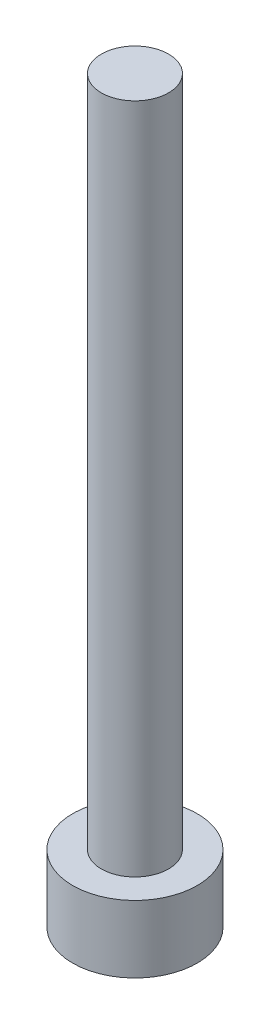
ISO-10303-21;
HEADER;
FILE_DESCRIPTION(('STEP AP214'),'2;1');
FILE_NAME('part.step','',(''),(''),'','','');
FILE_SCHEMA(('AUTOMOTIVE_DESIGN { 1 0 10303 214 1 1 1 1 }'));
ENDSEC;
DATA;
#1=APPLICATION_CONTEXT('core data for automotive mechanical design processes');
#2=APPLICATION_PROTOCOL_DEFINITION('international standard','automotive_design',2000,#1);
#3=PRODUCT_CONTEXT('',#1,'mechanical');
#4=PRODUCT('Part','Part','',(#3));
#5=PRODUCT_RELATED_PRODUCT_CATEGORY('part','',(#4));
#6=PRODUCT_DEFINITION_FORMATION('','',#4);
#7=PRODUCT_DEFINITION_CONTEXT('part definition',#1,'design');
#8=PRODUCT_DEFINITION('design','',#6,#7);
#9=PRODUCT_DEFINITION_SHAPE('','',#8);
#10=(LENGTH_UNIT() NAMED_UNIT(*) SI_UNIT(.MILLI.,.METRE.));
#11=(NAMED_UNIT(*) PLANE_ANGLE_UNIT() SI_UNIT($,.RADIAN.));
#12=(NAMED_UNIT(*) SI_UNIT($,.STERADIAN.) SOLID_ANGLE_UNIT());
#13=UNCERTAINTY_MEASURE_WITH_UNIT(LENGTH_MEASURE(1.E-05),#10,'distance_accuracy_value','');
#14=(GEOMETRIC_REPRESENTATION_CONTEXT(3) GLOBAL_UNCERTAINTY_ASSIGNED_CONTEXT((#13)) GLOBAL_UNIT_ASSIGNED_CONTEXT((#10,
#11,#12)) REPRESENTATION_CONTEXT('',''));
#15=CARTESIAN_POINT('',(0.,0.,0.));
#16=DIRECTION('',(0.,0.,1.));
#17=DIRECTION('',(1.,0.,0.));
#18=AXIS2_PLACEMENT_3D('',#15,#16,#17);
#19=CARTESIAN_POINT('',(0.,3.,0.));
#20=DIRECTION('',(0.,-1.,0.));
#21=DIRECTION('',(0.,0.,-1.));
#22=AXIS2_PLACEMENT_3D('',#19,#20,#21);
#23=CYLINDRICAL_SURFACE('',#22,2.78);
#24=CARTESIAN_POINT('',(0.,3.,0.));
#25=DIRECTION('',(0.,1.,0.));
#26=DIRECTION('',(0.,0.,1.));
#27=AXIS2_PLACEMENT_3D('',#24,#25,#26);
#28=CIRCLE('',#27,2.78);
#29=CARTESIAN_POINT('',(0.,3.,2.78));
#30=VERTEX_POINT('',#29);
#31=EDGE_CURVE('E10',#30,#30,#28,.T.);
#32=ORIENTED_EDGE('',*,*,#31,.F.);
#33=EDGE_LOOP('',(#32));
#34=FACE_BOUND('',#33,.T.);
#35=CARTESIAN_POINT('',(0.,0.,0.));
#36=DIRECTION('',(0.,1.,0.));
#37=DIRECTION('',(0.,0.,1.));
#38=AXIS2_PLACEMENT_3D('',#35,#36,#37);
#39=CIRCLE('',#38,2.78);
#40=CARTESIAN_POINT('',(0.,0.,2.78));
#41=VERTEX_POINT('',#40);
#42=EDGE_CURVE('E34',#41,#41,#39,.T.);
#43=ORIENTED_EDGE('',*,*,#42,.T.);
#44=EDGE_LOOP('',(#43));
#45=FACE_BOUND('',#44,.T.);
#46=ADVANCED_FACE('F31',(#34,#45),#23,.T.);
#47=CARTESIAN_POINT('',(0.,3.,0.));
#48=DIRECTION('',(0.,1.,0.));
#49=DIRECTION('',(0.,0.,1.));
#50=AXIS2_PLACEMENT_3D('',#47,#48,#49);
#51=PLANE('',#50);
#52=CARTESIAN_POINT('',(0.,3.,0.));
#53=DIRECTION('',(0.,1.,0.));
#54=DIRECTION('',(0.,0.,1.));
#55=AXIS2_PLACEMENT_3D('',#52,#53,#54);
#56=CIRCLE('',#55,1.5);
#57=CARTESIAN_POINT('',(0.,3.,1.5));
#58=VERTEX_POINT('',#57);
#59=EDGE_CURVE('E43',#58,#58,#56,.T.);
#60=ORIENTED_EDGE('',*,*,#59,.F.);
#61=EDGE_LOOP('',(#60));
#62=FACE_BOUND('',#61,.T.);
#63=ORIENTED_EDGE('',*,*,#31,.T.);
#64=EDGE_LOOP('',(#63));
#65=FACE_BOUND('',#64,.T.);
#66=ADVANCED_FACE('F58',(#62,#65),#51,.T.);
#67=CARTESIAN_POINT('',(0.,0.,0.));
#68=DIRECTION('',(0.,1.,0.));
#69=DIRECTION('',(0.,0.,1.));
#70=AXIS2_PLACEMENT_3D('',#67,#68,#69);
#71=PLANE('',#70);
#72=ORIENTED_EDGE('',*,*,#42,.F.);
#73=EDGE_LOOP('',(#72));
#74=FACE_BOUND('',#73,.T.);
#75=ADVANCED_FACE('F54',(#74),#71,.F.);
#76=CARTESIAN_POINT('',(0.,33.,0.));
#77=DIRECTION('',(0.,-1.,0.));
#78=DIRECTION('',(0.,0.,-1.));
#79=AXIS2_PLACEMENT_3D('',#76,#77,#78);
#80=CYLINDRICAL_SURFACE('',#79,1.5);
#81=CARTESIAN_POINT('',(0.,33.,0.));
#82=DIRECTION('',(0.,1.,0.));
#83=DIRECTION('',(0.,0.,1.));
#84=AXIS2_PLACEMENT_3D('',#81,#82,#83);
#85=CIRCLE('',#84,1.5);
#86=CARTESIAN_POINT('',(0.,33.,1.5));
#87=VERTEX_POINT('',#86);
#88=EDGE_CURVE('E41',#87,#87,#85,.T.);
#89=ORIENTED_EDGE('',*,*,#88,.F.);
#90=EDGE_LOOP('',(#89));
#91=FACE_BOUND('',#90,.T.);
#92=ORIENTED_EDGE('',*,*,#59,.T.);
#93=EDGE_LOOP('',(#92));
#94=FACE_BOUND('',#93,.T.);
#95=ADVANCED_FACE('F51',(#91,#94),#80,.T.);
#96=CARTESIAN_POINT('',(0.,33.,0.));
#97=DIRECTION('',(0.,1.,0.));
#98=DIRECTION('',(0.,0.,1.));
#99=AXIS2_PLACEMENT_3D('',#96,#97,#98);
#100=PLANE('',#99);
#101=ORIENTED_EDGE('',*,*,#88,.T.);
#102=EDGE_LOOP('',(#101));
#103=FACE_BOUND('',#102,.T.);
#104=ADVANCED_FACE('F49',(#103),#100,.T.);
#105=CLOSED_SHELL('',(#46,#66,#75,#95,#104));
#106=MANIFOLD_SOLID_BREP('B2',#105);
#107=ADVANCED_BREP_SHAPE_REPRESENTATION('',(#18,#106),#14);
#108=SHAPE_DEFINITION_REPRESENTATION(#9,#107);
ENDSEC;
END-ISO-10303-21;
